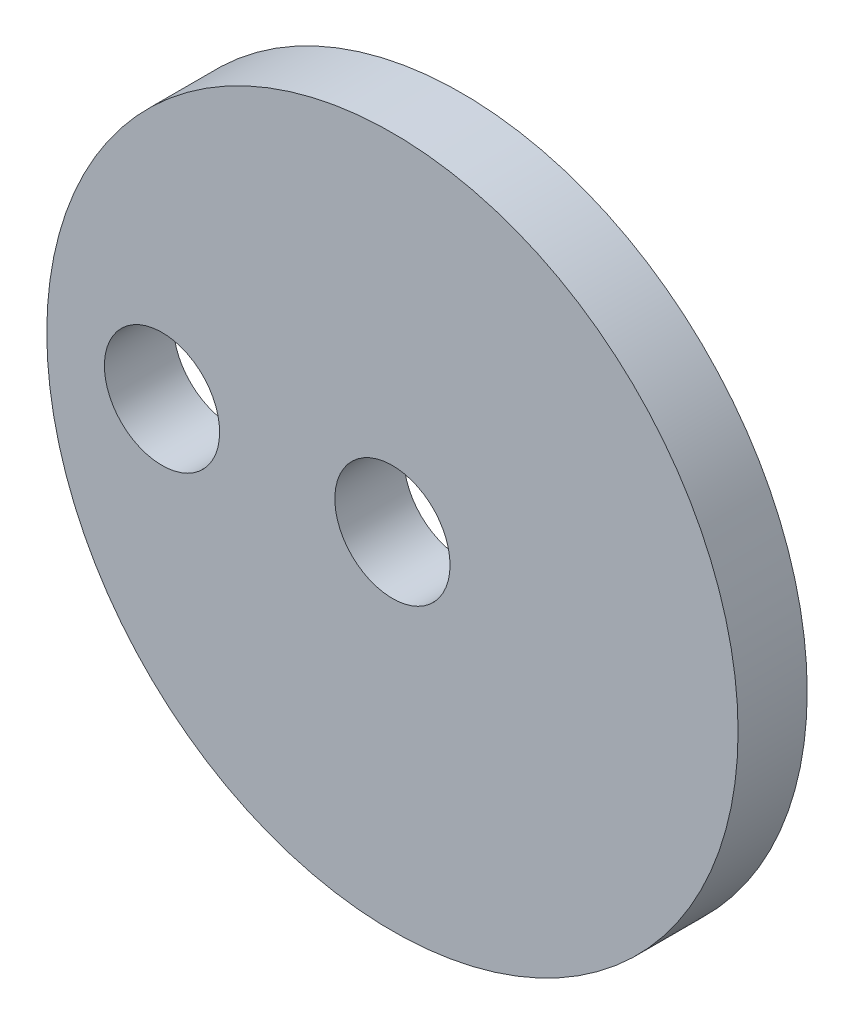
ISO-10303-21;
HEADER;
FILE_DESCRIPTION(('STEP AP214'),'2;1');
FILE_NAME('part.step','',(''),(''),'','','');
FILE_SCHEMA(('AUTOMOTIVE_DESIGN { 1 0 10303 214 1 1 1 1 }'));
ENDSEC;
DATA;
#1=APPLICATION_CONTEXT('core data for automotive mechanical design processes');
#2=APPLICATION_PROTOCOL_DEFINITION('international standard','automotive_design',2000,#1);
#3=PRODUCT_CONTEXT('',#1,'mechanical');
#4=PRODUCT('Part','Part','',(#3));
#5=PRODUCT_RELATED_PRODUCT_CATEGORY('part','',(#4));
#6=PRODUCT_DEFINITION_FORMATION('','',#4);
#7=PRODUCT_DEFINITION_CONTEXT('part definition',#1,'design');
#8=PRODUCT_DEFINITION('design','',#6,#7);
#9=PRODUCT_DEFINITION_SHAPE('','',#8);
#10=(LENGTH_UNIT() NAMED_UNIT(*) SI_UNIT(.MILLI.,.METRE.));
#11=(NAMED_UNIT(*) PLANE_ANGLE_UNIT() SI_UNIT($,.RADIAN.));
#12=(NAMED_UNIT(*) SI_UNIT($,.STERADIAN.) SOLID_ANGLE_UNIT());
#13=UNCERTAINTY_MEASURE_WITH_UNIT(LENGTH_MEASURE(1.E-05),#10,'distance_accuracy_value','');
#14=(GEOMETRIC_REPRESENTATION_CONTEXT(3) GLOBAL_UNCERTAINTY_ASSIGNED_CONTEXT((#13)) GLOBAL_UNIT_ASSIGNED_CONTEXT((#10,
#11,#12)) REPRESENTATION_CONTEXT('',''));
#15=CARTESIAN_POINT('',(0.,0.,0.));
#16=DIRECTION('',(0.,0.,1.));
#17=DIRECTION('',(1.,0.,0.));
#18=AXIS2_PLACEMENT_3D('',#15,#16,#17);
#19=CARTESIAN_POINT('',(0.,0.,3.));
#20=DIRECTION('',(0.,0.,-1.));
#21=DIRECTION('',(-1.,0.,0.));
#22=AXIS2_PLACEMENT_3D('',#19,#20,#21);
#23=CYLINDRICAL_SURFACE('',#22,15.);
#24=CARTESIAN_POINT('',(0.,0.,3.));
#25=DIRECTION('',(0.,0.,1.));
#26=DIRECTION('',(1.,0.,0.));
#27=AXIS2_PLACEMENT_3D('',#24,#25,#26);
#28=CIRCLE('',#27,15.);
#29=CARTESIAN_POINT('',(15.,0.,3.));
#30=VERTEX_POINT('',#29);
#31=EDGE_CURVE('E10',#30,#30,#28,.T.);
#32=ORIENTED_EDGE('',*,*,#31,.F.);
#33=EDGE_LOOP('',(#32));
#34=FACE_BOUND('',#33,.T.);
#35=CARTESIAN_POINT('',(0.,0.,0.));
#36=DIRECTION('',(0.,0.,1.));
#37=DIRECTION('',(1.,0.,0.));
#38=AXIS2_PLACEMENT_3D('',#35,#36,#37);
#39=CIRCLE('',#38,15.);
#40=CARTESIAN_POINT('',(15.,0.,0.));
#41=VERTEX_POINT('',#40);
#42=EDGE_CURVE('E34',#41,#41,#39,.T.);
#43=ORIENTED_EDGE('',*,*,#42,.T.);
#44=EDGE_LOOP('',(#43));
#45=FACE_BOUND('',#44,.T.);
#46=ADVANCED_FACE('F31',(#34,#45),#23,.T.);
#47=CARTESIAN_POINT('',(0.,0.,3.));
#48=DIRECTION('',(0.,0.,1.));
#49=DIRECTION('',(1.,0.,0.));
#50=AXIS2_PLACEMENT_3D('',#47,#48,#49);
#51=PLANE('',#50);
#52=CARTESIAN_POINT('',(0.,0.,3.));
#53=DIRECTION('',(0.,0.,1.));
#54=DIRECTION('',(1.,0.,0.));
#55=AXIS2_PLACEMENT_3D('',#52,#53,#54);
#56=CIRCLE('',#55,2.5);
#57=CARTESIAN_POINT('',(2.5,0.,3.));
#58=VERTEX_POINT('',#57);
#59=EDGE_CURVE('E49',#58,#58,#56,.T.);
#60=ORIENTED_EDGE('',*,*,#59,.F.);
#61=EDGE_LOOP('',(#60));
#62=FACE_BOUND('',#61,.T.);
#63=CARTESIAN_POINT('',(-10.,0.,3.));
#64=DIRECTION('',(0.,0.,1.));
#65=DIRECTION('',(1.,0.,0.));
#66=AXIS2_PLACEMENT_3D('',#63,#64,#65);
#67=CIRCLE('',#66,2.5);
#68=CARTESIAN_POINT('',(-7.5,0.,3.));
#69=VERTEX_POINT('',#68);
#70=EDGE_CURVE('E43',#69,#69,#67,.T.);
#71=ORIENTED_EDGE('',*,*,#70,.F.);
#72=EDGE_LOOP('',(#71));
#73=FACE_BOUND('',#72,.T.);
#74=ORIENTED_EDGE('',*,*,#31,.T.);
#75=EDGE_LOOP('',(#74));
#76=FACE_BOUND('',#75,.T.);
#77=ADVANCED_FACE('F65',(#62,#73,#76),#51,.T.);
#78=CARTESIAN_POINT('',(0.,0.,0.));
#79=DIRECTION('',(0.,0.,1.));
#80=DIRECTION('',(1.,0.,0.));
#81=AXIS2_PLACEMENT_3D('',#78,#79,#80);
#82=PLANE('',#81);
#83=CARTESIAN_POINT('',(0.,0.,0.));
#84=DIRECTION('',(0.,0.,1.));
#85=DIRECTION('',(1.,0.,0.));
#86=AXIS2_PLACEMENT_3D('',#83,#84,#85);
#87=CIRCLE('',#86,2.5);
#88=CARTESIAN_POINT('',(2.5,0.,0.));
#89=VERTEX_POINT('',#88);
#90=EDGE_CURVE('E41',#89,#89,#87,.T.);
#91=ORIENTED_EDGE('',*,*,#90,.T.);
#92=EDGE_LOOP('',(#91));
#93=FACE_BOUND('',#92,.T.);
#94=CARTESIAN_POINT('',(-10.,0.,0.));
#95=DIRECTION('',(0.,0.,1.));
#96=DIRECTION('',(1.,0.,0.));
#97=AXIS2_PLACEMENT_3D('',#94,#95,#96);
#98=CIRCLE('',#97,2.5);
#99=CARTESIAN_POINT('',(-7.5,0.,0.));
#100=VERTEX_POINT('',#99);
#101=EDGE_CURVE('E46',#100,#100,#98,.T.);
#102=ORIENTED_EDGE('',*,*,#101,.T.);
#103=EDGE_LOOP('',(#102));
#104=FACE_BOUND('',#103,.T.);
#105=ORIENTED_EDGE('',*,*,#42,.F.);
#106=EDGE_LOOP('',(#105));
#107=FACE_BOUND('',#106,.T.);
#108=ADVANCED_FACE('F55',(#93,#104,#107),#82,.F.);
#109=CARTESIAN_POINT('',(-10.,0.,0.));
#110=DIRECTION('',(0.,0.,1.));
#111=DIRECTION('',(1.,0.,0.));
#112=AXIS2_PLACEMENT_3D('',#109,#110,#111);
#113=CYLINDRICAL_SURFACE('',#112,2.5);
#114=ORIENTED_EDGE('',*,*,#101,.F.);
#115=EDGE_LOOP('',(#114));
#116=FACE_BOUND('',#115,.T.);
#117=ORIENTED_EDGE('',*,*,#70,.T.);
#118=EDGE_LOOP('',(#117));
#119=FACE_BOUND('',#118,.T.);
#120=ADVANCED_FACE('F61',(#116,#119),#113,.F.);
#121=CARTESIAN_POINT('',(0.,0.,0.));
#122=DIRECTION('',(0.,0.,1.));
#123=DIRECTION('',(1.,0.,0.));
#124=AXIS2_PLACEMENT_3D('',#121,#122,#123);
#125=CYLINDRICAL_SURFACE('',#124,2.5);
#126=ORIENTED_EDGE('',*,*,#90,.F.);
#127=EDGE_LOOP('',(#126));
#128=FACE_BOUND('',#127,.T.);
#129=ORIENTED_EDGE('',*,*,#59,.T.);
#130=EDGE_LOOP('',(#129));
#131=FACE_BOUND('',#130,.T.);
#132=ADVANCED_FACE('F58',(#128,#131),#125,.F.);
#133=CLOSED_SHELL('',(#46,#77,#108,#120,#132));
#134=MANIFOLD_SOLID_BREP('B2',#133);
#135=ADVANCED_BREP_SHAPE_REPRESENTATION('',(#18,#134),#14);
#136=SHAPE_DEFINITION_REPRESENTATION(#9,#135);
ENDSEC;
END-ISO-10303-21;
